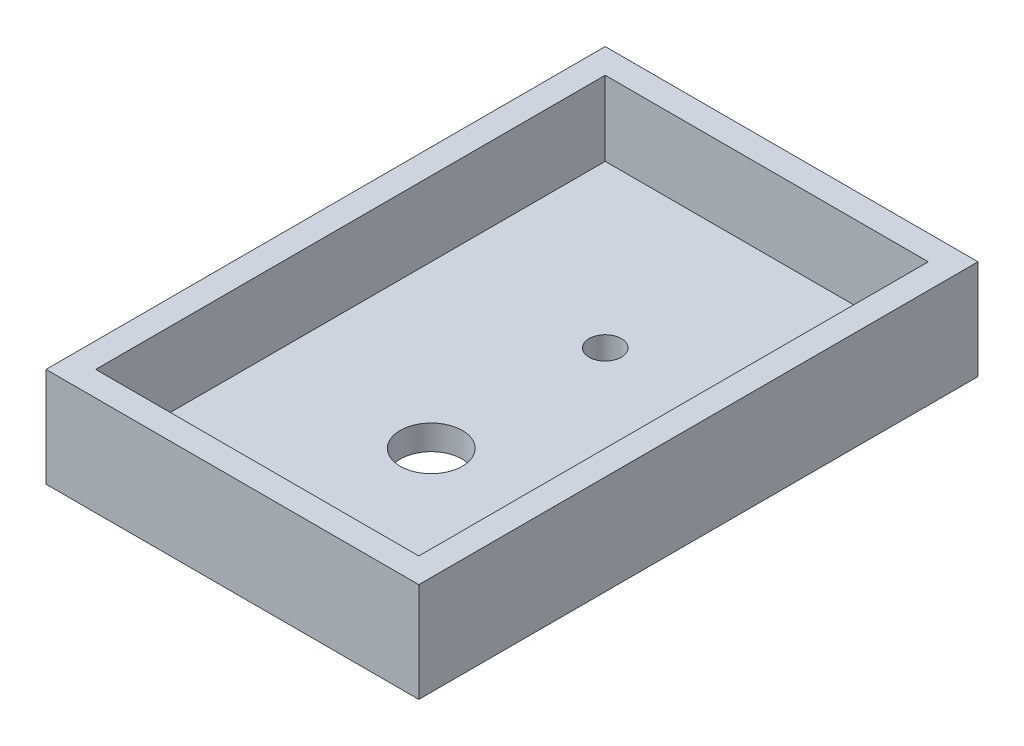
ISO-10303-21;
HEADER;
FILE_DESCRIPTION(('STEP AP214'),'2;1');
FILE_NAME('part.step','',(''),(''),'','','');
FILE_SCHEMA(('AUTOMOTIVE_DESIGN { 1 0 10303 214 1 1 1 1 }'));
ENDSEC;
DATA;
#1=APPLICATION_CONTEXT('core data for automotive mechanical design processes');
#2=APPLICATION_PROTOCOL_DEFINITION('international standard','automotive_design',2000,#1);
#3=PRODUCT_CONTEXT('',#1,'mechanical');
#4=PRODUCT('Part','Part','',(#3));
#5=PRODUCT_RELATED_PRODUCT_CATEGORY('part','',(#4));
#6=PRODUCT_DEFINITION_FORMATION('','',#4);
#7=PRODUCT_DEFINITION_CONTEXT('part definition',#1,'design');
#8=PRODUCT_DEFINITION('design','',#6,#7);
#9=PRODUCT_DEFINITION_SHAPE('','',#8);
#10=(LENGTH_UNIT() NAMED_UNIT(*) SI_UNIT(.MILLI.,.METRE.));
#11=(NAMED_UNIT(*) PLANE_ANGLE_UNIT() SI_UNIT($,.RADIAN.));
#12=(NAMED_UNIT(*) SI_UNIT($,.STERADIAN.) SOLID_ANGLE_UNIT());
#13=UNCERTAINTY_MEASURE_WITH_UNIT(LENGTH_MEASURE(1.E-05),#10,'distance_accuracy_value','');
#14=(GEOMETRIC_REPRESENTATION_CONTEXT(3) GLOBAL_UNCERTAINTY_ASSIGNED_CONTEXT((#13)) GLOBAL_UNIT_ASSIGNED_CONTEXT((#10,
#11,#12)) REPRESENTATION_CONTEXT('',''));
#15=CARTESIAN_POINT('',(0.,0.,0.));
#16=DIRECTION('',(0.,0.,1.));
#17=DIRECTION('',(1.,0.,0.));
#18=AXIS2_PLACEMENT_3D('',#15,#16,#17);
#19=CARTESIAN_POINT('',(0.,10.16,0.));
#20=DIRECTION('',(0.,-1.,0.));
#21=DIRECTION('',(0.,0.,-1.));
#22=AXIS2_PLACEMENT_3D('',#19,#20,#21);
#23=PLANE('',#22);
#24=DIRECTION('',(0.,0.,1.));
#25=VECTOR('',#24,1.);
#26=CARTESIAN_POINT('',(0.,10.16,0.));
#27=LINE('',#26,#25);
#28=CARTESIAN_POINT('',(0.,10.16,-57.15));
#29=VERTEX_POINT('',#28);
#30=CARTESIAN_POINT('',(0.,10.16,0.));
#31=VERTEX_POINT('',#30);
#32=EDGE_CURVE('E149',#29,#31,#27,.T.);
#33=ORIENTED_EDGE('',*,*,#32,.T.);
#34=DIRECTION('',(1.,0.,0.));
#35=VECTOR('',#34,1.);
#36=CARTESIAN_POINT('',(0.,10.16,0.));
#37=LINE('',#36,#35);
#38=CARTESIAN_POINT('',(38.1,10.16,0.));
#39=VERTEX_POINT('',#38);
#40=EDGE_CURVE('E91',#31,#39,#37,.T.);
#41=ORIENTED_EDGE('',*,*,#40,.T.);
#42=DIRECTION('',(0.,0.,-1.));
#43=VECTOR('',#42,1.);
#44=CARTESIAN_POINT('',(38.1,10.16,0.));
#45=LINE('',#44,#43);
#46=CARTESIAN_POINT('',(38.1,10.16,-57.15));
#47=VERTEX_POINT('',#46);
#48=EDGE_CURVE('E155',#39,#47,#45,.T.);
#49=ORIENTED_EDGE('',*,*,#48,.T.);
#50=DIRECTION('',(-1.,0.,0.));
#51=VECTOR('',#50,1.);
#52=CARTESIAN_POINT('',(0.,10.16,-57.15));
#53=LINE('',#52,#51);
#54=EDGE_CURVE('E61',#47,#29,#53,.T.);
#55=ORIENTED_EDGE('',*,*,#54,.T.);
#56=EDGE_LOOP('',(#33,#41,#49,#55));
#57=FACE_BOUND('',#56,.T.);
#58=DIRECTION('',(0.,0.,1.));
#59=VECTOR('',#58,1.);
#60=CARTESIAN_POINT('',(2.54,10.16,0.));
#61=LINE('',#60,#59);
#62=CARTESIAN_POINT('',(2.54,10.16,-54.61));
#63=VERTEX_POINT('',#62);
#64=CARTESIAN_POINT('',(2.54,10.16,-2.54));
#65=VERTEX_POINT('',#64);
#66=EDGE_CURVE('E139',#63,#65,#61,.T.);
#67=ORIENTED_EDGE('',*,*,#66,.F.);
#68=DIRECTION('',(-1.,0.,0.));
#69=VECTOR('',#68,1.);
#70=CARTESIAN_POINT('',(0.,10.16,-54.61));
#71=LINE('',#70,#69);
#72=CARTESIAN_POINT('',(35.56,10.16,-54.61));
#73=VERTEX_POINT('',#72);
#74=EDGE_CURVE('E150',#73,#63,#71,.T.);
#75=ORIENTED_EDGE('',*,*,#74,.F.);
#76=DIRECTION('',(0.,0.,-1.));
#77=VECTOR('',#76,1.);
#78=CARTESIAN_POINT('',(35.56,10.16,0.));
#79=LINE('',#78,#77);
#80=CARTESIAN_POINT('',(35.56,10.16,-2.54));
#81=VERTEX_POINT('',#80);
#82=EDGE_CURVE('E144',#81,#73,#79,.T.);
#83=ORIENTED_EDGE('',*,*,#82,.F.);
#84=DIRECTION('',(1.,0.,0.));
#85=VECTOR('',#84,1.);
#86=CARTESIAN_POINT('',(0.,10.16,-2.54));
#87=LINE('',#86,#85);
#88=EDGE_CURVE('E128',#65,#81,#87,.T.);
#89=ORIENTED_EDGE('',*,*,#88,.F.);
#90=EDGE_LOOP('',(#67,#75,#83,#89));
#91=FACE_BOUND('',#90,.T.);
#92=ADVANCED_FACE('F39',(#57,#91),#23,.F.);
#93=CARTESIAN_POINT('',(0.,10.16,0.));
#94=DIRECTION('',(1.,0.,0.));
#95=DIRECTION('',(0.,0.,-1.));
#96=AXIS2_PLACEMENT_3D('',#93,#94,#95);
#97=PLANE('',#96);
#98=DIRECTION('',(0.,0.,1.));
#99=VECTOR('',#98,1.);
#100=CARTESIAN_POINT('',(0.,0.,0.));
#101=LINE('',#100,#99);
#102=CARTESIAN_POINT('',(0.,0.,-57.15));
#103=VERTEX_POINT('',#102);
#104=CARTESIAN_POINT('',(0.,0.,0.));
#105=VERTEX_POINT('',#104);
#106=EDGE_CURVE('E156',#103,#105,#101,.T.);
#107=ORIENTED_EDGE('',*,*,#106,.T.);
#108=DIRECTION('',(0.,-1.,0.));
#109=VECTOR('',#108,1.);
#110=CARTESIAN_POINT('',(0.,10.16,0.));
#111=LINE('',#110,#109);
#112=EDGE_CURVE('E11',#31,#105,#111,.T.);
#113=ORIENTED_EDGE('',*,*,#112,.F.);
#114=ORIENTED_EDGE('',*,*,#32,.F.);
#115=DIRECTION('',(0.,-1.,0.));
#116=VECTOR('',#115,1.);
#117=CARTESIAN_POINT('',(0.,10.16,-57.15));
#118=LINE('',#117,#116);
#119=EDGE_CURVE('E154',#29,#103,#118,.T.);
#120=ORIENTED_EDGE('',*,*,#119,.T.);
#121=EDGE_LOOP('',(#107,#113,#114,#120));
#122=FACE_BOUND('',#121,.T.);
#123=ADVANCED_FACE('F41',(#122),#97,.F.);
#124=CARTESIAN_POINT('',(0.,10.16,0.));
#125=DIRECTION('',(0.,0.,-1.));
#126=DIRECTION('',(-1.,0.,0.));
#127=AXIS2_PLACEMENT_3D('',#124,#125,#126);
#128=PLANE('',#127);
#129=DIRECTION('',(1.,0.,0.));
#130=VECTOR('',#129,1.);
#131=CARTESIAN_POINT('',(0.,0.,0.));
#132=LINE('',#131,#130);
#133=CARTESIAN_POINT('',(38.1,0.,0.));
#134=VERTEX_POINT('',#133);
#135=EDGE_CURVE('E157',#105,#134,#132,.T.);
#136=ORIENTED_EDGE('',*,*,#135,.T.);
#137=DIRECTION('',(0.,-1.,0.));
#138=VECTOR('',#137,1.);
#139=CARTESIAN_POINT('',(38.1,10.16,0.));
#140=LINE('',#139,#138);
#141=EDGE_CURVE('E48',#39,#134,#140,.T.);
#142=ORIENTED_EDGE('',*,*,#141,.F.);
#143=ORIENTED_EDGE('',*,*,#40,.F.);
#144=ORIENTED_EDGE('',*,*,#112,.T.);
#145=EDGE_LOOP('',(#136,#142,#143,#144));
#146=FACE_BOUND('',#145,.T.);
#147=ADVANCED_FACE('F200',(#146),#128,.F.);
#148=CARTESIAN_POINT('',(38.1,10.16,0.));
#149=DIRECTION('',(-1.,0.,0.));
#150=DIRECTION('',(0.,0.,1.));
#151=AXIS2_PLACEMENT_3D('',#148,#149,#150);
#152=PLANE('',#151);
#153=DIRECTION('',(0.,0.,-1.));
#154=VECTOR('',#153,1.);
#155=CARTESIAN_POINT('',(38.1,0.,0.));
#156=LINE('',#155,#154);
#157=CARTESIAN_POINT('',(38.1,0.,-57.15));
#158=VERTEX_POINT('',#157);
#159=EDGE_CURVE('E161',#134,#158,#156,.T.);
#160=ORIENTED_EDGE('',*,*,#159,.T.);
#161=DIRECTION('',(0.,-1.,0.));
#162=VECTOR('',#161,1.);
#163=CARTESIAN_POINT('',(38.1,10.16,-57.15));
#164=LINE('',#163,#162);
#165=EDGE_CURVE('E164',#47,#158,#164,.T.);
#166=ORIENTED_EDGE('',*,*,#165,.F.);
#167=ORIENTED_EDGE('',*,*,#48,.F.);
#168=ORIENTED_EDGE('',*,*,#141,.T.);
#169=EDGE_LOOP('',(#160,#166,#167,#168));
#170=FACE_BOUND('',#169,.T.);
#171=ADVANCED_FACE('F209',(#170),#152,.F.);
#172=CARTESIAN_POINT('',(0.,10.16,-57.15));
#173=DIRECTION('',(0.,0.,1.));
#174=DIRECTION('',(1.,0.,0.));
#175=AXIS2_PLACEMENT_3D('',#172,#173,#174);
#176=PLANE('',#175);
#177=DIRECTION('',(-1.,0.,0.));
#178=VECTOR('',#177,1.);
#179=CARTESIAN_POINT('',(0.,0.,-57.15));
#180=LINE('',#179,#178);
#181=EDGE_CURVE('E88',#158,#103,#180,.T.);
#182=ORIENTED_EDGE('',*,*,#181,.T.);
#183=ORIENTED_EDGE('',*,*,#119,.F.);
#184=ORIENTED_EDGE('',*,*,#54,.F.);
#185=ORIENTED_EDGE('',*,*,#165,.T.);
#186=EDGE_LOOP('',(#182,#183,#184,#185));
#187=FACE_BOUND('',#186,.T.);
#188=ADVANCED_FACE('F210',(#187),#176,.F.);
#189=CARTESIAN_POINT('',(0.,0.,0.));
#190=DIRECTION('',(0.,-1.,0.));
#191=DIRECTION('',(0.,0.,-1.));
#192=AXIS2_PLACEMENT_3D('',#189,#190,#191);
#193=PLANE('',#192);
#194=CARTESIAN_POINT('',(19.05,0.,-38.1));
#195=DIRECTION('',(0.,-1.,0.));
#196=DIRECTION('',(0.,0.,-1.));
#197=AXIS2_PLACEMENT_3D('',#194,#195,#196);
#198=CIRCLE('',#197,1.651);
#199=CARTESIAN_POINT('',(19.05,0.,-39.751));
#200=VERTEX_POINT('',#199);
#201=EDGE_CURVE('E168',#200,#200,#198,.T.);
#202=ORIENTED_EDGE('',*,*,#201,.F.);
#203=EDGE_LOOP('',(#202));
#204=FACE_BOUND('',#203,.T.);
#205=CARTESIAN_POINT('',(19.05,0.,-20.32));
#206=DIRECTION('',(0.,-1.,0.));
#207=DIRECTION('',(0.,0.,-1.));
#208=AXIS2_PLACEMENT_3D('',#205,#206,#207);
#209=CIRCLE('',#208,3.175);
#210=CARTESIAN_POINT('',(19.05,0.,-23.495));
#211=VERTEX_POINT('',#210);
#212=EDGE_CURVE('E171',#211,#211,#209,.T.);
#213=ORIENTED_EDGE('',*,*,#212,.F.);
#214=EDGE_LOOP('',(#213));
#215=FACE_BOUND('',#214,.T.);
#216=ORIENTED_EDGE('',*,*,#106,.F.);
#217=ORIENTED_EDGE('',*,*,#181,.F.);
#218=ORIENTED_EDGE('',*,*,#159,.F.);
#219=ORIENTED_EDGE('',*,*,#135,.F.);
#220=EDGE_LOOP('',(#216,#217,#218,#219));
#221=FACE_BOUND('',#220,.T.);
#222=ADVANCED_FACE('F204',(#204,#215,#221),#193,.T.);
#223=CARTESIAN_POINT('',(2.54,10.16,0.));
#224=DIRECTION('',(1.,0.,0.));
#225=DIRECTION('',(0.,0.,-1.));
#226=AXIS2_PLACEMENT_3D('',#223,#224,#225);
#227=PLANE('',#226);
#228=DIRECTION('',(0.,0.,1.));
#229=VECTOR('',#228,1.);
#230=CARTESIAN_POINT('',(2.54,2.54,0.));
#231=LINE('',#230,#229);
#232=CARTESIAN_POINT('',(2.54,2.54,-54.61));
#233=VERTEX_POINT('',#232);
#234=CARTESIAN_POINT('',(2.54,2.54,-2.54));
#235=VERTEX_POINT('',#234);
#236=EDGE_CURVE('E121',#233,#235,#231,.T.);
#237=ORIENTED_EDGE('',*,*,#236,.F.);
#238=DIRECTION('',(0.,-1.,0.));
#239=VECTOR('',#238,1.);
#240=CARTESIAN_POINT('',(2.54,10.16,-54.61));
#241=LINE('',#240,#239);
#242=EDGE_CURVE('E143',#63,#233,#241,.T.);
#243=ORIENTED_EDGE('',*,*,#242,.F.);
#244=ORIENTED_EDGE('',*,*,#66,.T.);
#245=DIRECTION('',(0.,-1.,0.));
#246=VECTOR('',#245,1.);
#247=CARTESIAN_POINT('',(2.54,10.16,-2.54));
#248=LINE('',#247,#246);
#249=EDGE_CURVE('E132',#65,#235,#248,.T.);
#250=ORIENTED_EDGE('',*,*,#249,.T.);
#251=EDGE_LOOP('',(#237,#243,#244,#250));
#252=FACE_BOUND('',#251,.T.);
#253=ADVANCED_FACE('F186',(#252),#227,.T.);
#254=CARTESIAN_POINT('',(0.,10.16,-2.54));
#255=DIRECTION('',(0.,0.,-1.));
#256=DIRECTION('',(-1.,0.,0.));
#257=AXIS2_PLACEMENT_3D('',#254,#255,#256);
#258=PLANE('',#257);
#259=DIRECTION('',(1.,0.,0.));
#260=VECTOR('',#259,1.);
#261=CARTESIAN_POINT('',(0.,2.54,-2.54));
#262=LINE('',#261,#260);
#263=CARTESIAN_POINT('',(35.56,2.54,-2.54));
#264=VERTEX_POINT('',#263);
#265=EDGE_CURVE('E113',#235,#264,#262,.T.);
#266=ORIENTED_EDGE('',*,*,#265,.F.);
#267=ORIENTED_EDGE('',*,*,#249,.F.);
#268=ORIENTED_EDGE('',*,*,#88,.T.);
#269=DIRECTION('',(0.,-1.,0.));
#270=VECTOR('',#269,1.);
#271=CARTESIAN_POINT('',(35.56,10.16,-2.54));
#272=LINE('',#271,#270);
#273=EDGE_CURVE('E130',#81,#264,#272,.T.);
#274=ORIENTED_EDGE('',*,*,#273,.T.);
#275=EDGE_LOOP('',(#266,#267,#268,#274));
#276=FACE_BOUND('',#275,.T.);
#277=ADVANCED_FACE('F126',(#276),#258,.T.);
#278=CARTESIAN_POINT('',(35.56,10.16,0.));
#279=DIRECTION('',(-1.,0.,0.));
#280=DIRECTION('',(0.,0.,1.));
#281=AXIS2_PLACEMENT_3D('',#278,#279,#280);
#282=PLANE('',#281);
#283=DIRECTION('',(0.,0.,-1.));
#284=VECTOR('',#283,1.);
#285=CARTESIAN_POINT('',(35.56,2.54,0.));
#286=LINE('',#285,#284);
#287=CARTESIAN_POINT('',(35.56,2.54,-54.61));
#288=VERTEX_POINT('',#287);
#289=EDGE_CURVE('E120',#264,#288,#286,.T.);
#290=ORIENTED_EDGE('',*,*,#289,.F.);
#291=ORIENTED_EDGE('',*,*,#273,.F.);
#292=ORIENTED_EDGE('',*,*,#82,.T.);
#293=DIRECTION('',(0.,-1.,0.));
#294=VECTOR('',#293,1.);
#295=CARTESIAN_POINT('',(35.56,10.16,-54.61));
#296=LINE('',#295,#294);
#297=EDGE_CURVE('E57',#73,#288,#296,.T.);
#298=ORIENTED_EDGE('',*,*,#297,.T.);
#299=EDGE_LOOP('',(#290,#291,#292,#298));
#300=FACE_BOUND('',#299,.T.);
#301=ADVANCED_FACE('F131',(#300),#282,.T.);
#302=CARTESIAN_POINT('',(0.,10.16,-54.61));
#303=DIRECTION('',(0.,0.,1.));
#304=DIRECTION('',(1.,0.,0.));
#305=AXIS2_PLACEMENT_3D('',#302,#303,#304);
#306=PLANE('',#305);
#307=DIRECTION('',(-1.,0.,0.));
#308=VECTOR('',#307,1.);
#309=CARTESIAN_POINT('',(0.,2.54,-54.61));
#310=LINE('',#309,#308);
#311=EDGE_CURVE('E136',#288,#233,#310,.T.);
#312=ORIENTED_EDGE('',*,*,#311,.F.);
#313=ORIENTED_EDGE('',*,*,#297,.F.);
#314=ORIENTED_EDGE('',*,*,#74,.T.);
#315=ORIENTED_EDGE('',*,*,#242,.T.);
#316=EDGE_LOOP('',(#312,#313,#314,#315));
#317=FACE_BOUND('',#316,.T.);
#318=ADVANCED_FACE('F188',(#317),#306,.T.);
#319=CARTESIAN_POINT('',(0.,2.54,0.));
#320=DIRECTION('',(0.,-1.,0.));
#321=DIRECTION('',(0.,0.,-1.));
#322=AXIS2_PLACEMENT_3D('',#319,#320,#321);
#323=PLANE('',#322);
#324=CARTESIAN_POINT('',(19.05,2.54,-38.1));
#325=DIRECTION('',(0.,-1.,0.));
#326=DIRECTION('',(0.,0.,-1.));
#327=AXIS2_PLACEMENT_3D('',#324,#325,#326);
#328=CIRCLE('',#327,1.651);
#329=CARTESIAN_POINT('',(19.05,2.54,-39.751));
#330=VERTEX_POINT('',#329);
#331=EDGE_CURVE('E43',#330,#330,#328,.T.);
#332=ORIENTED_EDGE('',*,*,#331,.T.);
#333=EDGE_LOOP('',(#332));
#334=FACE_BOUND('',#333,.T.);
#335=CARTESIAN_POINT('',(19.05,2.54,-20.32));
#336=DIRECTION('',(0.,-1.,0.));
#337=DIRECTION('',(0.,0.,-1.));
#338=AXIS2_PLACEMENT_3D('',#335,#336,#337);
#339=CIRCLE('',#338,3.175);
#340=CARTESIAN_POINT('',(19.05,2.54,-23.495));
#341=VERTEX_POINT('',#340);
#342=EDGE_CURVE('E169',#341,#341,#339,.T.);
#343=ORIENTED_EDGE('',*,*,#342,.T.);
#344=EDGE_LOOP('',(#343));
#345=FACE_BOUND('',#344,.T.);
#346=ORIENTED_EDGE('',*,*,#236,.T.);
#347=ORIENTED_EDGE('',*,*,#265,.T.);
#348=ORIENTED_EDGE('',*,*,#289,.T.);
#349=ORIENTED_EDGE('',*,*,#311,.T.);
#350=EDGE_LOOP('',(#346,#347,#348,#349));
#351=FACE_BOUND('',#350,.T.);
#352=ADVANCED_FACE('F119',(#334,#345,#351),#323,.F.);
#353=CARTESIAN_POINT('',(19.05,27.94,-20.32));
#354=DIRECTION('',(0.,-1.,0.));
#355=DIRECTION('',(0.,0.,-1.));
#356=AXIS2_PLACEMENT_3D('',#353,#354,#355);
#357=CYLINDRICAL_SURFACE('',#356,3.175);
#358=ORIENTED_EDGE('',*,*,#212,.T.);
#359=EDGE_LOOP('',(#358));
#360=FACE_BOUND('',#359,.T.);
#361=ORIENTED_EDGE('',*,*,#342,.F.);
#362=EDGE_LOOP('',(#361));
#363=FACE_BOUND('',#362,.T.);
#364=ADVANCED_FACE('F281',(#360,#363),#357,.F.);
#365=CARTESIAN_POINT('',(19.05,27.94,-38.1));
#366=DIRECTION('',(0.,-1.,0.));
#367=DIRECTION('',(0.,0.,-1.));
#368=AXIS2_PLACEMENT_3D('',#365,#366,#367);
#369=CYLINDRICAL_SURFACE('',#368,1.651);
#370=ORIENTED_EDGE('',*,*,#201,.T.);
#371=EDGE_LOOP('',(#370));
#372=FACE_BOUND('',#371,.T.);
#373=ORIENTED_EDGE('',*,*,#331,.F.);
#374=EDGE_LOOP('',(#373));
#375=FACE_BOUND('',#374,.T.);
#376=ADVANCED_FACE('F294',(#372,#375),#369,.F.);
#377=CLOSED_SHELL('',(#92,#123,#147,#171,#188,#222,#253,#277,#301,#318,#352,#364,#376));
#378=MANIFOLD_SOLID_BREP('B2',#377);
#379=ADVANCED_BREP_SHAPE_REPRESENTATION('',(#18,#378),#14);
#380=SHAPE_DEFINITION_REPRESENTATION(#9,#379);
ENDSEC;
END-ISO-10303-21;
